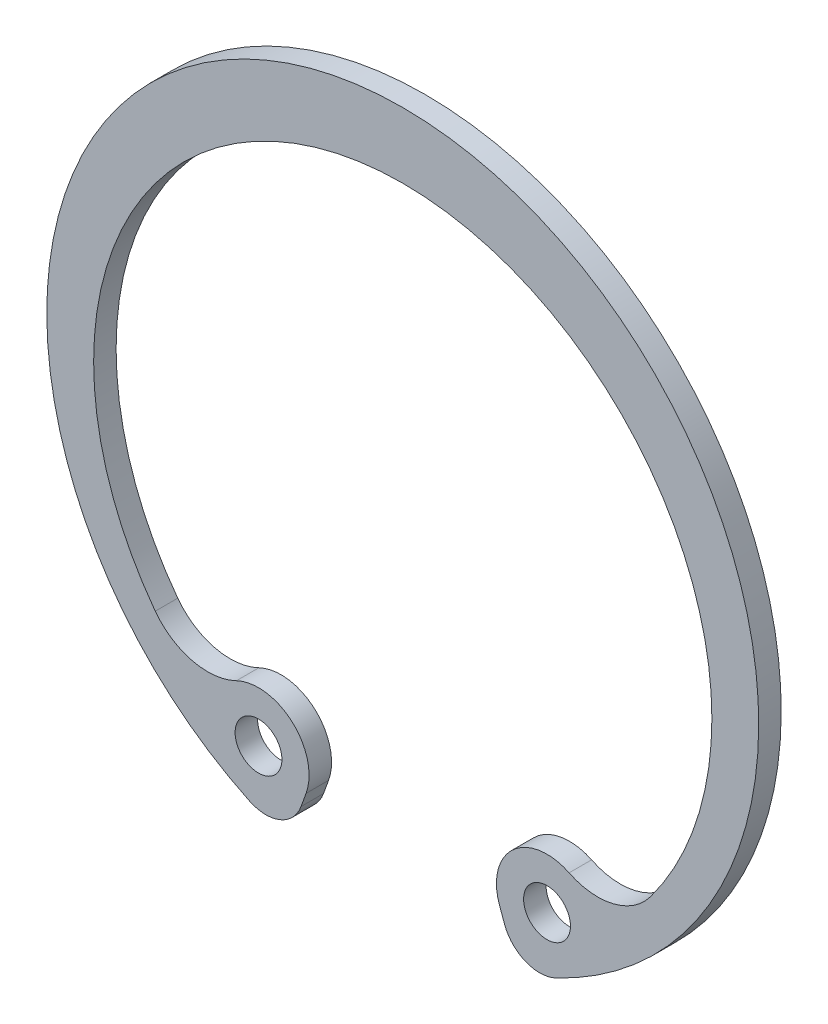
ISO-10303-21;
HEADER;
FILE_DESCRIPTION(('STEP AP214'),'2;1');
FILE_NAME('part.step','',(''),(''),'','','');
FILE_SCHEMA(('AUTOMOTIVE_DESIGN { 1 0 10303 214 1 1 1 1 }'));
ENDSEC;
DATA;
#1=APPLICATION_CONTEXT('core data for automotive mechanical design processes');
#2=APPLICATION_PROTOCOL_DEFINITION('international standard','automotive_design',2000,#1);
#3=PRODUCT_CONTEXT('',#1,'mechanical');
#4=PRODUCT('Part','Part','',(#3));
#5=PRODUCT_RELATED_PRODUCT_CATEGORY('part','',(#4));
#6=PRODUCT_DEFINITION_FORMATION('','',#4);
#7=PRODUCT_DEFINITION_CONTEXT('part definition',#1,'design');
#8=PRODUCT_DEFINITION('design','',#6,#7);
#9=PRODUCT_DEFINITION_SHAPE('','',#8);
#10=(LENGTH_UNIT() NAMED_UNIT(*) SI_UNIT(.MILLI.,.METRE.));
#11=(NAMED_UNIT(*) PLANE_ANGLE_UNIT() SI_UNIT($,.RADIAN.));
#12=(NAMED_UNIT(*) SI_UNIT($,.STERADIAN.) SOLID_ANGLE_UNIT());
#13=UNCERTAINTY_MEASURE_WITH_UNIT(LENGTH_MEASURE(1.E-05),#10,'distance_accuracy_value','');
#14=(GEOMETRIC_REPRESENTATION_CONTEXT(3) GLOBAL_UNCERTAINTY_ASSIGNED_CONTEXT((#13)) GLOBAL_UNIT_ASSIGNED_CONTEXT((#10,
#11,#12)) REPRESENTATION_CONTEXT('',''));
#15=CARTESIAN_POINT('',(0.,0.,0.));
#16=DIRECTION('',(0.,0.,1.));
#17=DIRECTION('',(1.,0.,0.));
#18=AXIS2_PLACEMENT_3D('',#15,#16,#17);
#19=CARTESIAN_POINT('',(-10.4080193370849,-8.78929608365658,1.2));
#20=DIRECTION('',(0.,0.,1.));
#21=DIRECTION('',(1.,0.,0.));
#22=AXIS2_PLACEMENT_3D('',#19,#20,#21);
#23=PLANE('',#22);
#24=CARTESIAN_POINT('',(7.7,-14.3666279968544,1.2));
#25=DIRECTION('',(0.,0.,1.));
#26=DIRECTION('',(1.,0.,0.));
#27=AXIS2_PLACEMENT_3D('',#24,#25,#26);
#28=CIRCLE('',#27,1.25);
#29=CARTESIAN_POINT('',(8.95,-14.3666279968544,1.2));
#30=VERTEX_POINT('',#29);
#31=EDGE_CURVE('E145',#30,#30,#28,.T.);
#32=ORIENTED_EDGE('',*,*,#31,.F.);
#33=EDGE_LOOP('',(#32));
#34=FACE_BOUND('',#33,.T.);
#35=CARTESIAN_POINT('',(-10.4080193370849,-8.78929608365658,1.2));
#36=DIRECTION('',(0.,0.,-1.));
#37=DIRECTION('',(1.,0.,0.));
#38=AXIS2_PLACEMENT_3D('',#35,#36,#37);
#39=CIRCLE('',#38,3.5);
#40=CARTESIAN_POINT('',(-8.87929874356921,-11.9377899056231,1.2));
#41=VERTEX_POINT('',#40);
#42=CARTESIAN_POINT('',(-13.2101783893769,-10.8864142600257,1.2));
#43=VERTEX_POINT('',#42);
#44=EDGE_CURVE('E160',#41,#43,#39,.T.);
#45=ORIENTED_EDGE('',*,*,#44,.T.);
#46=CARTESIAN_POINT('',(0.,-1.,1.2));
#47=DIRECTION('',(0.,0.,-1.));
#48=DIRECTION('',(1.,0.,0.));
#49=AXIS2_PLACEMENT_3D('',#46,#47,#48);
#50=CIRCLE('',#49,16.5);
#51=CARTESIAN_POINT('',(13.2101783893769,-10.8864142600257,1.2));
#52=VERTEX_POINT('',#51);
#53=EDGE_CURVE('E98',#43,#52,#50,.T.);
#54=ORIENTED_EDGE('',*,*,#53,.T.);
#55=CARTESIAN_POINT('',(10.4080193370849,-8.78929608365658,1.2));
#56=DIRECTION('',(0.,0.,-1.));
#57=DIRECTION('',(-1.,0.,0.));
#58=AXIS2_PLACEMENT_3D('',#55,#56,#57);
#59=CIRCLE('',#58,3.5);
#60=CARTESIAN_POINT('',(8.87929874356922,-11.9377899056231,1.2));
#61=VERTEX_POINT('',#60);
#62=EDGE_CURVE('E181',#52,#61,#59,.T.);
#63=ORIENTED_EDGE('',*,*,#62,.T.);
#64=CARTESIAN_POINT('',(7.7,-14.3666279968544,1.2));
#65=DIRECTION('',(0.,0.,1.));
#66=DIRECTION('',(-1.,0.,0.));
#67=AXIS2_PLACEMENT_3D('',#64,#65,#66);
#68=CIRCLE('',#67,2.7);
#69=CARTESIAN_POINT('',(5.16064723245692,-15.2840632926498,1.2));
#70=VERTEX_POINT('',#69);
#71=EDGE_CURVE('E200',#61,#70,#68,.T.);
#72=ORIENTED_EDGE('',*,*,#71,.T.);
#73=DIRECTION('',(0.339790850294611,-0.940501025015957,0.));
#74=VECTOR('',#73,1.);
#75=CARTESIAN_POINT('',(5.16064723245692,-15.2840632926498,1.2));
#76=LINE('',#75,#74);
#77=CARTESIAN_POINT('',(5.42925882902579,-16.0275485327178,1.2));
#78=VERTEX_POINT('',#77);
#79=EDGE_CURVE('E197',#70,#78,#76,.T.);
#80=ORIENTED_EDGE('',*,*,#79,.T.);
#81=CARTESIAN_POINT('',(7.3102608790577,-15.3479668321286,1.2));
#82=DIRECTION('',(0.,0.,1.));
#83=DIRECTION('',(1.,0.,0.));
#84=AXIS2_PLACEMENT_3D('',#81,#82,#83);
#85=CIRCLE('',#84,2.);
#86=CARTESIAN_POINT('',(8.17029157071155,-17.1536099888496,1.2));
#87=VERTEX_POINT('',#86);
#88=EDGE_CURVE('E199',#78,#87,#85,.T.);
#89=ORIENTED_EDGE('',*,*,#88,.T.);
#90=CARTESIAN_POINT('',(0.,0.,1.2));
#91=DIRECTION('',(0.,0.,1.));
#92=DIRECTION('',(1.,0.,0.));
#93=AXIS2_PLACEMENT_3D('',#90,#91,#92);
#94=CIRCLE('',#93,19.);
#95=CARTESIAN_POINT('',(-8.17029157071155,-17.1536099888496,1.2));
#96=VERTEX_POINT('',#95);
#97=EDGE_CURVE('E123',#87,#96,#94,.T.);
#98=ORIENTED_EDGE('',*,*,#97,.T.);
#99=CARTESIAN_POINT('',(-7.31026087905769,-15.3479668321286,1.2));
#100=DIRECTION('',(0.,0.,1.));
#101=DIRECTION('',(-1.,0.,0.));
#102=AXIS2_PLACEMENT_3D('',#99,#100,#101);
#103=CIRCLE('',#102,2.);
#104=CARTESIAN_POINT('',(-5.42925882902578,-16.0275485327178,1.2));
#105=VERTEX_POINT('',#104);
#106=EDGE_CURVE('E117',#96,#105,#103,.T.);
#107=ORIENTED_EDGE('',*,*,#106,.T.);
#108=DIRECTION('',(0.339790850294609,0.940501025015957,0.));
#109=VECTOR('',#108,1.);
#110=CARTESIAN_POINT('',(-5.16064723245692,-15.2840632926498,1.2));
#111=LINE('',#110,#109);
#112=CARTESIAN_POINT('',(-5.16064723245692,-15.2840632926498,1.2));
#113=VERTEX_POINT('',#112);
#114=EDGE_CURVE('E121',#105,#113,#111,.T.);
#115=ORIENTED_EDGE('',*,*,#114,.T.);
#116=CARTESIAN_POINT('',(-7.7,-14.3666279968544,1.2));
#117=DIRECTION('',(0.,0.,1.));
#118=DIRECTION('',(1.,0.,0.));
#119=AXIS2_PLACEMENT_3D('',#116,#117,#118);
#120=CIRCLE('',#119,2.7);
#121=EDGE_CURVE('E49',#113,#41,#120,.T.);
#122=ORIENTED_EDGE('',*,*,#121,.T.);
#123=EDGE_LOOP('',(#45,#54,#63,#72,#80,#89,#98,#107,#115,#122));
#124=FACE_BOUND('',#123,.T.);
#125=CARTESIAN_POINT('',(-7.7,-14.3666279968544,1.2));
#126=DIRECTION('',(0.,0.,1.));
#127=DIRECTION('',(1.,0.,0.));
#128=AXIS2_PLACEMENT_3D('',#125,#126,#127);
#129=CIRCLE('',#128,1.25);
#130=CARTESIAN_POINT('',(-6.45,-14.3666279968544,1.2));
#131=VERTEX_POINT('',#130);
#132=EDGE_CURVE('E211',#131,#131,#129,.T.);
#133=ORIENTED_EDGE('',*,*,#132,.F.);
#134=EDGE_LOOP('',(#133));
#135=FACE_BOUND('',#134,.T.);
#136=ADVANCED_FACE('F32',(#34,#124,#135),#23,.T.);
#137=CARTESIAN_POINT('',(-10.4080193370849,-8.78929608365658,0.));
#138=DIRECTION('',(0.,0.,1.));
#139=DIRECTION('',(1.,0.,0.));
#140=AXIS2_PLACEMENT_3D('',#137,#138,#139);
#141=PLANE('',#140);
#142=CARTESIAN_POINT('',(-10.4080193370849,-8.78929608365658,0.));
#143=DIRECTION('',(0.,0.,-1.));
#144=DIRECTION('',(1.,0.,0.));
#145=AXIS2_PLACEMENT_3D('',#142,#143,#144);
#146=CIRCLE('',#145,3.5);
#147=CARTESIAN_POINT('',(-8.87929874356921,-11.9377899056231,0.));
#148=VERTEX_POINT('',#147);
#149=CARTESIAN_POINT('',(-13.2101783893769,-10.8864142600257,0.));
#150=VERTEX_POINT('',#149);
#151=EDGE_CURVE('E141',#148,#150,#146,.T.);
#152=ORIENTED_EDGE('',*,*,#151,.F.);
#153=CARTESIAN_POINT('',(-7.7,-14.3666279968544,0.));
#154=DIRECTION('',(0.,0.,1.));
#155=DIRECTION('',(1.,0.,0.));
#156=AXIS2_PLACEMENT_3D('',#153,#154,#155);
#157=CIRCLE('',#156,2.7);
#158=CARTESIAN_POINT('',(-5.16064723245692,-15.2840632926498,0.));
#159=VERTEX_POINT('',#158);
#160=EDGE_CURVE('E90',#159,#148,#157,.T.);
#161=ORIENTED_EDGE('',*,*,#160,.F.);
#162=DIRECTION('',(0.339790850294609,0.940501025015957,0.));
#163=VECTOR('',#162,1.);
#164=CARTESIAN_POINT('',(-5.16064723245692,-15.2840632926498,0.));
#165=LINE('',#164,#163);
#166=CARTESIAN_POINT('',(-5.42925882902578,-16.0275485327178,0.));
#167=VERTEX_POINT('',#166);
#168=EDGE_CURVE('E84',#167,#159,#165,.T.);
#169=ORIENTED_EDGE('',*,*,#168,.F.);
#170=CARTESIAN_POINT('',(-7.31026087905769,-15.3479668321286,0.));
#171=DIRECTION('',(0.,0.,1.));
#172=DIRECTION('',(-1.,0.,0.));
#173=AXIS2_PLACEMENT_3D('',#170,#171,#172);
#174=CIRCLE('',#173,2.);
#175=CARTESIAN_POINT('',(-8.17029157071155,-17.1536099888496,0.));
#176=VERTEX_POINT('',#175);
#177=EDGE_CURVE('E131',#176,#167,#174,.T.);
#178=ORIENTED_EDGE('',*,*,#177,.F.);
#179=CARTESIAN_POINT('',(0.,0.,0.));
#180=DIRECTION('',(0.,0.,1.));
#181=DIRECTION('',(1.,0.,0.));
#182=AXIS2_PLACEMENT_3D('',#179,#180,#181);
#183=CIRCLE('',#182,19.);
#184=CARTESIAN_POINT('',(8.17029157071155,-17.1536099888496,0.));
#185=VERTEX_POINT('',#184);
#186=EDGE_CURVE('E155',#185,#176,#183,.T.);
#187=ORIENTED_EDGE('',*,*,#186,.F.);
#188=CARTESIAN_POINT('',(7.3102608790577,-15.3479668321286,0.));
#189=DIRECTION('',(0.,0.,1.));
#190=DIRECTION('',(1.,0.,0.));
#191=AXIS2_PLACEMENT_3D('',#188,#189,#190);
#192=CIRCLE('',#191,2.);
#193=CARTESIAN_POINT('',(5.42925882902579,-16.0275485327178,0.));
#194=VERTEX_POINT('',#193);
#195=EDGE_CURVE('E153',#194,#185,#192,.T.);
#196=ORIENTED_EDGE('',*,*,#195,.F.);
#197=DIRECTION('',(0.339790850294611,-0.940501025015957,0.));
#198=VECTOR('',#197,1.);
#199=CARTESIAN_POINT('',(5.16064723245692,-15.2840632926498,0.));
#200=LINE('',#199,#198);
#201=CARTESIAN_POINT('',(5.16064723245692,-15.2840632926498,0.));
#202=VERTEX_POINT('',#201);
#203=EDGE_CURVE('E151',#202,#194,#200,.T.);
#204=ORIENTED_EDGE('',*,*,#203,.F.);
#205=CARTESIAN_POINT('',(7.7,-14.3666279968544,0.));
#206=DIRECTION('',(0.,0.,1.));
#207=DIRECTION('',(-1.,0.,0.));
#208=AXIS2_PLACEMENT_3D('',#205,#206,#207);
#209=CIRCLE('',#208,2.7);
#210=CARTESIAN_POINT('',(8.87929874356922,-11.9377899056231,0.));
#211=VERTEX_POINT('',#210);
#212=EDGE_CURVE('E149',#211,#202,#209,.T.);
#213=ORIENTED_EDGE('',*,*,#212,.F.);
#214=CARTESIAN_POINT('',(10.4080193370849,-8.78929608365658,0.));
#215=DIRECTION('',(0.,0.,-1.));
#216=DIRECTION('',(-1.,0.,0.));
#217=AXIS2_PLACEMENT_3D('',#214,#215,#216);
#218=CIRCLE('',#217,3.5);
#219=CARTESIAN_POINT('',(13.2101783893769,-10.8864142600257,0.));
#220=VERTEX_POINT('',#219);
#221=EDGE_CURVE('E147',#220,#211,#218,.T.);
#222=ORIENTED_EDGE('',*,*,#221,.F.);
#223=CARTESIAN_POINT('',(0.,-1.,0.));
#224=DIRECTION('',(0.,0.,-1.));
#225=DIRECTION('',(1.,0.,0.));
#226=AXIS2_PLACEMENT_3D('',#223,#224,#225);
#227=CIRCLE('',#226,16.5);
#228=EDGE_CURVE('E144',#150,#220,#227,.T.);
#229=ORIENTED_EDGE('',*,*,#228,.F.);
#230=EDGE_LOOP('',(#152,#161,#169,#178,#187,#196,#204,#213,#222,#229));
#231=FACE_BOUND('',#230,.T.);
#232=CARTESIAN_POINT('',(7.7,-14.3666279968544,0.));
#233=DIRECTION('',(0.,0.,1.));
#234=DIRECTION('',(1.,0.,0.));
#235=AXIS2_PLACEMENT_3D('',#232,#233,#234);
#236=CIRCLE('',#235,1.25);
#237=CARTESIAN_POINT('',(8.95,-14.3666279968544,0.));
#238=VERTEX_POINT('',#237);
#239=EDGE_CURVE('E208',#238,#238,#236,.T.);
#240=ORIENTED_EDGE('',*,*,#239,.T.);
#241=EDGE_LOOP('',(#240));
#242=FACE_BOUND('',#241,.T.);
#243=CARTESIAN_POINT('',(-7.7,-14.3666279968544,0.));
#244=DIRECTION('',(0.,0.,1.));
#245=DIRECTION('',(1.,0.,0.));
#246=AXIS2_PLACEMENT_3D('',#243,#244,#245);
#247=CIRCLE('',#246,1.25);
#248=CARTESIAN_POINT('',(-6.45,-14.3666279968544,0.));
#249=VERTEX_POINT('',#248);
#250=EDGE_CURVE('E214',#249,#249,#247,.T.);
#251=ORIENTED_EDGE('',*,*,#250,.T.);
#252=EDGE_LOOP('',(#251));
#253=FACE_BOUND('',#252,.T.);
#254=ADVANCED_FACE('F185',(#231,#242,#253),#141,.F.);
#255=CARTESIAN_POINT('',(-10.4080193370849,-8.78929608365658,1.2));
#256=DIRECTION('',(0.,0.,-1.));
#257=DIRECTION('',(-1.,0.,0.));
#258=AXIS2_PLACEMENT_3D('',#255,#256,#257);
#259=CYLINDRICAL_SURFACE('',#258,3.5);
#260=ORIENTED_EDGE('',*,*,#151,.T.);
#261=DIRECTION('',(0.,0.,-1.));
#262=VECTOR('',#261,1.);
#263=CARTESIAN_POINT('',(-13.2101783893769,-10.8864142600257,1.2));
#264=LINE('',#263,#262);
#265=EDGE_CURVE('E11',#43,#150,#264,.T.);
#266=ORIENTED_EDGE('',*,*,#265,.F.);
#267=ORIENTED_EDGE('',*,*,#44,.F.);
#268=DIRECTION('',(0.,0.,-1.));
#269=VECTOR('',#268,1.);
#270=CARTESIAN_POINT('',(-8.87929874356921,-11.9377899056231,1.2));
#271=LINE('',#270,#269);
#272=EDGE_CURVE('E137',#41,#148,#271,.T.);
#273=ORIENTED_EDGE('',*,*,#272,.T.);
#274=EDGE_LOOP('',(#260,#266,#267,#273));
#275=FACE_BOUND('',#274,.T.);
#276=ADVANCED_FACE('F34',(#275),#259,.F.);
#277=CARTESIAN_POINT('',(0.,-1.,1.2));
#278=DIRECTION('',(0.,0.,-1.));
#279=DIRECTION('',(-1.,0.,0.));
#280=AXIS2_PLACEMENT_3D('',#277,#278,#279);
#281=CYLINDRICAL_SURFACE('',#280,16.5);
#282=ORIENTED_EDGE('',*,*,#228,.T.);
#283=DIRECTION('',(0.,0.,-1.));
#284=VECTOR('',#283,1.);
#285=CARTESIAN_POINT('',(13.2101783893769,-10.8864142600257,1.2));
#286=LINE('',#285,#284);
#287=EDGE_CURVE('E41',#52,#220,#286,.T.);
#288=ORIENTED_EDGE('',*,*,#287,.F.);
#289=ORIENTED_EDGE('',*,*,#53,.F.);
#290=ORIENTED_EDGE('',*,*,#265,.T.);
#291=EDGE_LOOP('',(#282,#288,#289,#290));
#292=FACE_BOUND('',#291,.T.);
#293=ADVANCED_FACE('F254',(#292),#281,.F.);
#294=CARTESIAN_POINT('',(10.4080193370849,-8.78929608365658,1.2));
#295=DIRECTION('',(0.,0.,-1.));
#296=DIRECTION('',(-1.,0.,0.));
#297=AXIS2_PLACEMENT_3D('',#294,#295,#296);
#298=CYLINDRICAL_SURFACE('',#297,3.5);
#299=ORIENTED_EDGE('',*,*,#221,.T.);
#300=DIRECTION('',(0.,0.,-1.));
#301=VECTOR('',#300,1.);
#302=CARTESIAN_POINT('',(8.87929874356922,-11.9377899056231,1.2));
#303=LINE('',#302,#301);
#304=EDGE_CURVE('E173',#61,#211,#303,.T.);
#305=ORIENTED_EDGE('',*,*,#304,.F.);
#306=ORIENTED_EDGE('',*,*,#62,.F.);
#307=ORIENTED_EDGE('',*,*,#287,.T.);
#308=EDGE_LOOP('',(#299,#305,#306,#307));
#309=FACE_BOUND('',#308,.T.);
#310=ADVANCED_FACE('F179',(#309),#298,.F.);
#311=CARTESIAN_POINT('',(7.7,-14.3666279968544,1.2));
#312=DIRECTION('',(0.,0.,-1.));
#313=DIRECTION('',(-1.,0.,0.));
#314=AXIS2_PLACEMENT_3D('',#311,#312,#313);
#315=CYLINDRICAL_SURFACE('',#314,2.7);
#316=ORIENTED_EDGE('',*,*,#212,.T.);
#317=DIRECTION('',(0.,0.,-1.));
#318=VECTOR('',#317,1.);
#319=CARTESIAN_POINT('',(5.16064723245692,-15.2840632926498,1.2));
#320=LINE('',#319,#318);
#321=EDGE_CURVE('E170',#70,#202,#320,.T.);
#322=ORIENTED_EDGE('',*,*,#321,.F.);
#323=ORIENTED_EDGE('',*,*,#71,.F.);
#324=ORIENTED_EDGE('',*,*,#304,.T.);
#325=EDGE_LOOP('',(#316,#322,#323,#324));
#326=FACE_BOUND('',#325,.T.);
#327=ADVANCED_FACE('F191',(#326),#315,.T.);
#328=CARTESIAN_POINT('',(5.16064723245692,-15.2840632926498,1.2));
#329=DIRECTION('',(0.940501025015957,0.339790850294611,0.));
#330=DIRECTION('',(-0.339790850294611,0.940501025015957,0.));
#331=AXIS2_PLACEMENT_3D('',#328,#329,#330);
#332=PLANE('',#331);
#333=ORIENTED_EDGE('',*,*,#203,.T.);
#334=DIRECTION('',(0.,0.,-1.));
#335=VECTOR('',#334,1.);
#336=CARTESIAN_POINT('',(5.42925882902579,-16.0275485327178,1.2));
#337=LINE('',#336,#335);
#338=EDGE_CURVE('E167',#78,#194,#337,.T.);
#339=ORIENTED_EDGE('',*,*,#338,.F.);
#340=ORIENTED_EDGE('',*,*,#79,.F.);
#341=ORIENTED_EDGE('',*,*,#321,.T.);
#342=EDGE_LOOP('',(#333,#339,#340,#341));
#343=FACE_BOUND('',#342,.T.);
#344=ADVANCED_FACE('F195',(#343),#332,.F.);
#345=CARTESIAN_POINT('',(7.3102608790577,-15.3479668321286,1.2));
#346=DIRECTION('',(0.,0.,-1.));
#347=DIRECTION('',(-1.,0.,0.));
#348=AXIS2_PLACEMENT_3D('',#345,#346,#347);
#349=CYLINDRICAL_SURFACE('',#348,2.);
#350=ORIENTED_EDGE('',*,*,#195,.T.);
#351=DIRECTION('',(0.,0.,-1.));
#352=VECTOR('',#351,1.);
#353=CARTESIAN_POINT('',(8.17029157071155,-17.1536099888496,1.2));
#354=LINE('',#353,#352);
#355=EDGE_CURVE('E164',#87,#185,#354,.T.);
#356=ORIENTED_EDGE('',*,*,#355,.F.);
#357=ORIENTED_EDGE('',*,*,#88,.F.);
#358=ORIENTED_EDGE('',*,*,#338,.T.);
#359=EDGE_LOOP('',(#350,#356,#357,#358));
#360=FACE_BOUND('',#359,.T.);
#361=ADVANCED_FACE('F244',(#360),#349,.T.);
#362=CARTESIAN_POINT('',(0.,0.,1.2));
#363=DIRECTION('',(0.,0.,-1.));
#364=DIRECTION('',(-1.,0.,0.));
#365=AXIS2_PLACEMENT_3D('',#362,#363,#364);
#366=CYLINDRICAL_SURFACE('',#365,19.);
#367=ORIENTED_EDGE('',*,*,#186,.T.);
#368=DIRECTION('',(0.,0.,-1.));
#369=VECTOR('',#368,1.);
#370=CARTESIAN_POINT('',(-8.17029157071155,-17.1536099888496,1.2));
#371=LINE('',#370,#369);
#372=EDGE_CURVE('E132',#96,#176,#371,.T.);
#373=ORIENTED_EDGE('',*,*,#372,.F.);
#374=ORIENTED_EDGE('',*,*,#97,.F.);
#375=ORIENTED_EDGE('',*,*,#355,.T.);
#376=EDGE_LOOP('',(#367,#373,#374,#375));
#377=FACE_BOUND('',#376,.T.);
#378=ADVANCED_FACE('F241',(#377),#366,.T.);
#379=CARTESIAN_POINT('',(-7.31026087905769,-15.3479668321286,1.2));
#380=DIRECTION('',(0.,0.,-1.));
#381=DIRECTION('',(-1.,0.,0.));
#382=AXIS2_PLACEMENT_3D('',#379,#380,#381);
#383=CYLINDRICAL_SURFACE('',#382,2.);
#384=ORIENTED_EDGE('',*,*,#177,.T.);
#385=DIRECTION('',(0.,0.,-1.));
#386=VECTOR('',#385,1.);
#387=CARTESIAN_POINT('',(-5.42925882902578,-16.0275485327178,1.2));
#388=LINE('',#387,#386);
#389=EDGE_CURVE('E128',#105,#167,#388,.T.);
#390=ORIENTED_EDGE('',*,*,#389,.F.);
#391=ORIENTED_EDGE('',*,*,#106,.F.);
#392=ORIENTED_EDGE('',*,*,#372,.T.);
#393=EDGE_LOOP('',(#384,#390,#391,#392));
#394=FACE_BOUND('',#393,.T.);
#395=ADVANCED_FACE('F129',(#394),#383,.T.);
#396=CARTESIAN_POINT('',(-5.16064723245692,-15.2840632926498,1.2));
#397=DIRECTION('',(-0.940501025015957,0.339790850294609,0.));
#398=DIRECTION('',(-0.339790850294609,-0.940501025015957,0.));
#399=AXIS2_PLACEMENT_3D('',#396,#397,#398);
#400=PLANE('',#399);
#401=ORIENTED_EDGE('',*,*,#168,.T.);
#402=DIRECTION('',(0.,0.,-1.));
#403=VECTOR('',#402,1.);
#404=CARTESIAN_POINT('',(-5.16064723245692,-15.2840632926498,1.2));
#405=LINE('',#404,#403);
#406=EDGE_CURVE('E133',#113,#159,#405,.T.);
#407=ORIENTED_EDGE('',*,*,#406,.F.);
#408=ORIENTED_EDGE('',*,*,#114,.F.);
#409=ORIENTED_EDGE('',*,*,#389,.T.);
#410=EDGE_LOOP('',(#401,#407,#408,#409));
#411=FACE_BOUND('',#410,.T.);
#412=ADVANCED_FACE('F135',(#411),#400,.F.);
#413=CARTESIAN_POINT('',(-7.7,-14.3666279968544,1.2));
#414=DIRECTION('',(0.,0.,-1.));
#415=DIRECTION('',(-1.,0.,0.));
#416=AXIS2_PLACEMENT_3D('',#413,#414,#415);
#417=CYLINDRICAL_SURFACE('',#416,2.7);
#418=ORIENTED_EDGE('',*,*,#160,.T.);
#419=ORIENTED_EDGE('',*,*,#272,.F.);
#420=ORIENTED_EDGE('',*,*,#121,.F.);
#421=ORIENTED_EDGE('',*,*,#406,.T.);
#422=EDGE_LOOP('',(#418,#419,#420,#421));
#423=FACE_BOUND('',#422,.T.);
#424=ADVANCED_FACE('F234',(#423),#417,.T.);
#425=CARTESIAN_POINT('',(7.7,-14.3666279968544,1.2));
#426=DIRECTION('',(0.,0.,-1.));
#427=DIRECTION('',(-1.,0.,0.));
#428=AXIS2_PLACEMENT_3D('',#425,#426,#427);
#429=CYLINDRICAL_SURFACE('',#428,1.25);
#430=ORIENTED_EDGE('',*,*,#31,.T.);
#431=EDGE_LOOP('',(#430));
#432=FACE_BOUND('',#431,.T.);
#433=ORIENTED_EDGE('',*,*,#239,.F.);
#434=EDGE_LOOP('',(#433));
#435=FACE_BOUND('',#434,.T.);
#436=ADVANCED_FACE('F231',(#432,#435),#429,.F.);
#437=CARTESIAN_POINT('',(-7.7,-14.3666279968544,1.2));
#438=DIRECTION('',(0.,0.,-1.));
#439=DIRECTION('',(-1.,0.,0.));
#440=AXIS2_PLACEMENT_3D('',#437,#438,#439);
#441=CYLINDRICAL_SURFACE('',#440,1.25);
#442=ORIENTED_EDGE('',*,*,#132,.T.);
#443=EDGE_LOOP('',(#442));
#444=FACE_BOUND('',#443,.T.);
#445=ORIENTED_EDGE('',*,*,#250,.F.);
#446=EDGE_LOOP('',(#445));
#447=FACE_BOUND('',#446,.T.);
#448=ADVANCED_FACE('F220',(#444,#447),#441,.F.);
#449=CLOSED_SHELL('',(#136,#254,#276,#293,#310,#327,#344,#361,#378,#395,#412,#424,#436,#448));
#450=MANIFOLD_SOLID_BREP('B2',#449);
#451=ADVANCED_BREP_SHAPE_REPRESENTATION('',(#18,#450),#14);
#452=SHAPE_DEFINITION_REPRESENTATION(#9,#451);
ENDSEC;
END-ISO-10303-21;
